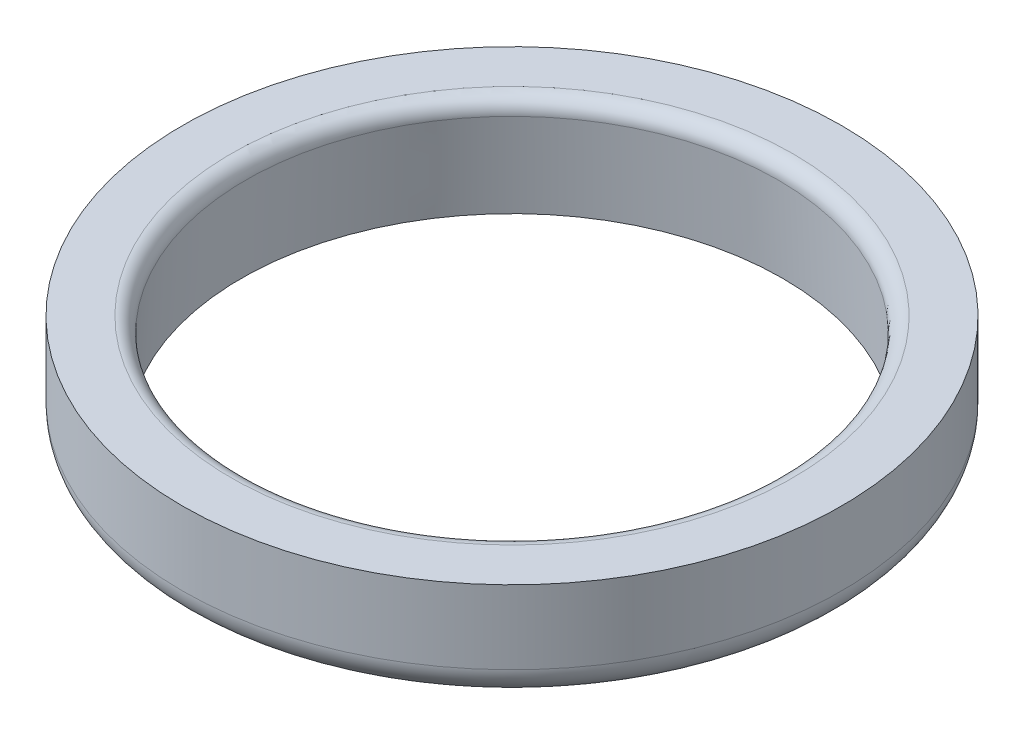
ISO-10303-21;
HEADER;
FILE_DESCRIPTION(('STEP AP214'),'2;1');
FILE_NAME('part.step','',(''),(''),'','','');
FILE_SCHEMA(('AUTOMOTIVE_DESIGN { 1 0 10303 214 1 1 1 1 }'));
ENDSEC;
DATA;
#1=APPLICATION_CONTEXT('core data for automotive mechanical design processes');
#2=APPLICATION_PROTOCOL_DEFINITION('international standard','automotive_design',2000,#1);
#3=PRODUCT_CONTEXT('',#1,'mechanical');
#4=PRODUCT('Part','Part','',(#3));
#5=PRODUCT_RELATED_PRODUCT_CATEGORY('part','',(#4));
#6=PRODUCT_DEFINITION_FORMATION('','',#4);
#7=PRODUCT_DEFINITION_CONTEXT('part definition',#1,'design');
#8=PRODUCT_DEFINITION('design','',#6,#7);
#9=PRODUCT_DEFINITION_SHAPE('','',#8);
#10=(LENGTH_UNIT() NAMED_UNIT(*) SI_UNIT(.MILLI.,.METRE.));
#11=(NAMED_UNIT(*) PLANE_ANGLE_UNIT() SI_UNIT($,.RADIAN.));
#12=(NAMED_UNIT(*) SI_UNIT($,.STERADIAN.) SOLID_ANGLE_UNIT());
#13=UNCERTAINTY_MEASURE_WITH_UNIT(LENGTH_MEASURE(1.E-05),#10,'distance_accuracy_value','');
#14=(GEOMETRIC_REPRESENTATION_CONTEXT(3) GLOBAL_UNCERTAINTY_ASSIGNED_CONTEXT((#13)) GLOBAL_UNIT_ASSIGNED_CONTEXT((#10,
#11,#12)) REPRESENTATION_CONTEXT('',''));
#15=CARTESIAN_POINT('',(0.,0.,0.));
#16=DIRECTION('',(0.,0.,1.));
#17=DIRECTION('',(1.,0.,0.));
#18=AXIS2_PLACEMENT_3D('',#15,#16,#17);
#19=CARTESIAN_POINT('',(0.,0.,0.));
#20=DIRECTION('',(0.,-1.,0.));
#21=DIRECTION('',(0.,0.,-1.));
#22=AXIS2_PLACEMENT_3D('',#19,#20,#21);
#23=CYLINDRICAL_SURFACE('',#22,5.6);
#24=CARTESIAN_POINT('',(0.,0.639049854712754,0.));
#25=DIRECTION('',(0.,1.,0.));
#26=DIRECTION('',(0.,0.,1.));
#27=AXIS2_PLACEMENT_3D('',#24,#25,#26);
#28=CIRCLE('',#27,5.6);
#29=CARTESIAN_POINT('',(0.,0.639049854712754,5.6));
#30=VERTEX_POINT('',#29);
#31=EDGE_CURVE('E42',#30,#30,#28,.T.);
#32=ORIENTED_EDGE('',*,*,#31,.T.);
#33=EDGE_LOOP('',(#32));
#34=FACE_BOUND('',#33,.T.);
#35=CARTESIAN_POINT('',(0.,1.88904985471275,0.));
#36=DIRECTION('',(0.,-1.,0.));
#37=DIRECTION('',(0.,0.,-1.));
#38=AXIS2_PLACEMENT_3D('',#35,#36,#37);
#39=CIRCLE('',#38,5.6);
#40=CARTESIAN_POINT('',(0.,1.88904985471275,-5.6));
#41=VERTEX_POINT('',#40);
#42=EDGE_CURVE('E51',#41,#41,#39,.T.);
#43=ORIENTED_EDGE('',*,*,#42,.T.);
#44=EDGE_LOOP('',(#43));
#45=FACE_BOUND('',#44,.T.);
#46=ADVANCED_FACE('F31',(#34,#45),#23,.T.);
#47=CARTESIAN_POINT('',(-4.6,1.88904985471275,0.));
#48=DIRECTION('',(0.,-1.,0.));
#49=DIRECTION('',(0.,0.,-1.));
#50=AXIS2_PLACEMENT_3D('',#47,#48,#49);
#51=PLANE('',#50);
#52=CARTESIAN_POINT('',(0.,1.88904985471275,0.));
#53=DIRECTION('',(0.,-1.,0.));
#54=DIRECTION('',(0.,0.,-1.));
#55=AXIS2_PLACEMENT_3D('',#52,#53,#54);
#56=CIRCLE('',#55,4.77173141757492);
#57=CARTESIAN_POINT('',(0.,1.88904985471275,-4.77173141757492));
#58=VERTEX_POINT('',#57);
#59=EDGE_CURVE('E38',#58,#58,#56,.T.);
#60=ORIENTED_EDGE('',*,*,#59,.T.);
#61=EDGE_LOOP('',(#60));
#62=FACE_BOUND('',#61,.T.);
#63=ORIENTED_EDGE('',*,*,#42,.F.);
#64=EDGE_LOOP('',(#63));
#65=FACE_BOUND('',#64,.T.);
#66=ADVANCED_FACE('F71',(#62,#65),#51,.F.);
#67=CARTESIAN_POINT('',(0.,0.139049854712754,0.));
#68=DIRECTION('',(0.,-1.,0.));
#69=DIRECTION('',(0.,0.,-1.));
#70=AXIS2_PLACEMENT_3D('',#67,#68,#69);
#71=CONICAL_SURFACE('',#70,4.6,0.0523598775598299);
#72=CARTESIAN_POINT('',(0.,1.62596586565202,0.));
#73=DIRECTION('',(0.,1.,0.));
#74=DIRECTION('',(0.,0.,1.));
#75=AXIS2_PLACEMENT_3D('',#72,#73,#74);
#76=CIRCLE('',#75,4.52207403388628);
#77=CARTESIAN_POINT('',(0.,1.62596586565202,4.52207403388628));
#78=VERTEX_POINT('',#77);
#79=EDGE_CURVE('E10',#78,#78,#76,.T.);
#80=ORIENTED_EDGE('',*,*,#79,.T.);
#81=EDGE_LOOP('',(#80));
#82=FACE_BOUND('',#81,.T.);
#83=CARTESIAN_POINT('',(0.,0.139049854712754,0.));
#84=DIRECTION('',(0.,-1.,0.));
#85=DIRECTION('',(0.,0.,-1.));
#86=AXIS2_PLACEMENT_3D('',#83,#84,#85);
#87=CIRCLE('',#86,4.6);
#88=CARTESIAN_POINT('',(0.,0.139049854712754,-4.6));
#89=VERTEX_POINT('',#88);
#90=EDGE_CURVE('E54',#89,#89,#87,.T.);
#91=ORIENTED_EDGE('',*,*,#90,.T.);
#92=EDGE_LOOP('',(#91));
#93=FACE_BOUND('',#92,.T.);
#94=ADVANCED_FACE('F58',(#82,#93),#71,.F.);
#95=CARTESIAN_POINT('',(-5.6,0.139049854712754,0.));
#96=DIRECTION('',(0.,1.,0.));
#97=DIRECTION('',(0.,0.,1.));
#98=AXIS2_PLACEMENT_3D('',#95,#96,#97);
#99=PLANE('',#98);
#100=CARTESIAN_POINT('',(0.,0.139049854712754,0.));
#101=DIRECTION('',(0.,1.,0.));
#102=DIRECTION('',(0.,0.,1.));
#103=AXIS2_PLACEMENT_3D('',#100,#101,#102);
#104=CIRCLE('',#103,5.1);
#105=CARTESIAN_POINT('',(0.,0.139049854712754,5.1));
#106=VERTEX_POINT('',#105);
#107=EDGE_CURVE('E46',#106,#106,#104,.F.);
#108=ORIENTED_EDGE('',*,*,#107,.T.);
#109=EDGE_LOOP('',(#108));
#110=FACE_BOUND('',#109,.T.);
#111=ORIENTED_EDGE('',*,*,#90,.F.);
#112=EDGE_LOOP('',(#111));
#113=FACE_BOUND('',#112,.T.);
#114=ADVANCED_FACE('F60',(#110,#113),#99,.F.);
#115=CARTESIAN_POINT('',(0.,0.639049854712754,0.));
#116=DIRECTION('',(0.,1.,0.));
#117=DIRECTION('',(0.,0.,1.));
#118=AXIS2_PLACEMENT_3D('',#115,#116,#117);
#119=TOROIDAL_SURFACE('',#118,5.1,0.5);
#120=ORIENTED_EDGE('',*,*,#31,.F.);
#121=EDGE_LOOP('',(#120));
#122=FACE_BOUND('',#121,.T.);
#123=ORIENTED_EDGE('',*,*,#107,.F.);
#124=EDGE_LOOP('',(#123));
#125=FACE_BOUND('',#124,.T.);
#126=ADVANCED_FACE('F62',(#122,#125),#119,.T.);
#127=CARTESIAN_POINT('',(0.,1.63904985471275,0.));
#128=DIRECTION('',(0.,-1.,0.));
#129=DIRECTION('',(0.,0.,-1.));
#130=AXIS2_PLACEMENT_3D('',#127,#128,#129);
#131=TOROIDAL_SURFACE('',#130,4.77173141757492,0.25);
#132=ORIENTED_EDGE('',*,*,#79,.F.);
#133=EDGE_LOOP('',(#132));
#134=FACE_BOUND('',#133,.T.);
#135=ORIENTED_EDGE('',*,*,#59,.F.);
#136=EDGE_LOOP('',(#135));
#137=FACE_BOUND('',#136,.T.);
#138=ADVANCED_FACE('F33',(#134,#137),#131,.T.);
#139=CLOSED_SHELL('',(#46,#66,#94,#114,#126,#138));
#140=MANIFOLD_SOLID_BREP('B2',#139);
#141=ADVANCED_BREP_SHAPE_REPRESENTATION('',(#18,#140),#14);
#142=SHAPE_DEFINITION_REPRESENTATION(#9,#141);
ENDSEC;
END-ISO-10303-21;
